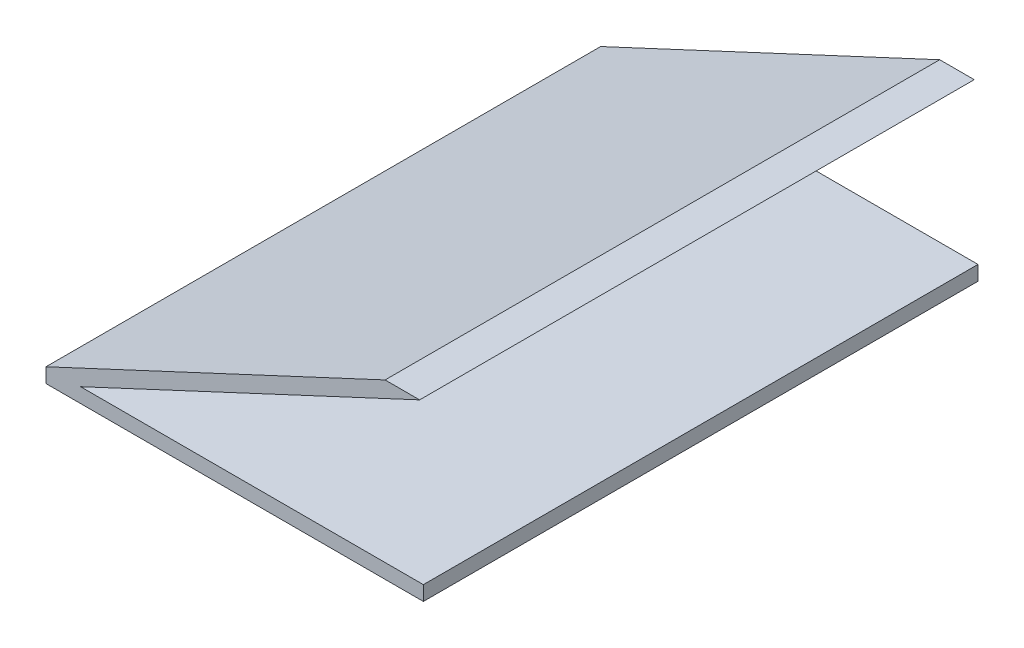
ISO-10303-21;
HEADER;
FILE_DESCRIPTION(('STEP AP214'),'2;1');
FILE_NAME('part.step','',(''),(''),'','','');
FILE_SCHEMA(('AUTOMOTIVE_DESIGN { 1 0 10303 214 1 1 1 1 }'));
ENDSEC;
DATA;
#1=APPLICATION_CONTEXT('core data for automotive mechanical design processes');
#2=APPLICATION_PROTOCOL_DEFINITION('international standard','automotive_design',2000,#1);
#3=PRODUCT_CONTEXT('',#1,'mechanical');
#4=PRODUCT('Part','Part','',(#3));
#5=PRODUCT_RELATED_PRODUCT_CATEGORY('part','',(#4));
#6=PRODUCT_DEFINITION_FORMATION('','',#4);
#7=PRODUCT_DEFINITION_CONTEXT('part definition',#1,'design');
#8=PRODUCT_DEFINITION('design','',#6,#7);
#9=PRODUCT_DEFINITION_SHAPE('','',#8);
#10=(LENGTH_UNIT() NAMED_UNIT(*) SI_UNIT(.MILLI.,.METRE.));
#11=(NAMED_UNIT(*) PLANE_ANGLE_UNIT() SI_UNIT($,.RADIAN.));
#12=(NAMED_UNIT(*) SI_UNIT($,.STERADIAN.) SOLID_ANGLE_UNIT());
#13=UNCERTAINTY_MEASURE_WITH_UNIT(LENGTH_MEASURE(1.E-05),#10,'distance_accuracy_value','');
#14=(GEOMETRIC_REPRESENTATION_CONTEXT(3) GLOBAL_UNCERTAINTY_ASSIGNED_CONTEXT((#13)) GLOBAL_UNIT_ASSIGNED_CONTEXT((#10,
#11,#12)) REPRESENTATION_CONTEXT('',''));
#15=CARTESIAN_POINT('',(0.,0.,0.));
#16=DIRECTION('',(0.,0.,1.));
#17=DIRECTION('',(1.,0.,0.));
#18=AXIS2_PLACEMENT_3D('',#15,#16,#17);
#19=CARTESIAN_POINT('',(0.,0.,380.));
#20=DIRECTION('',(0.,-1.,0.));
#21=DIRECTION('',(0.,0.,-1.));
#22=AXIS2_PLACEMENT_3D('',#19,#20,#21);
#23=PLANE('',#22);
#24=DIRECTION('',(-1.,0.,0.));
#25=VECTOR('',#24,1.);
#26=CARTESIAN_POINT('',(0.,0.,0.));
#27=LINE('',#26,#25);
#28=CARTESIAN_POINT('',(23.6620158315253,0.,0.));
#29=VERTEX_POINT('',#28);
#30=CARTESIAN_POINT('',(0.,0.,0.));
#31=VERTEX_POINT('',#30);
#32=EDGE_CURVE('E138',#29,#31,#27,.T.);
#33=ORIENTED_EDGE('',*,*,#32,.T.);
#34=DIRECTION('',(0.,0.,-1.));
#35=VECTOR('',#34,1.);
#36=CARTESIAN_POINT('',(0.,0.,380.));
#37=LINE('',#36,#35);
#38=CARTESIAN_POINT('',(0.,0.,380.));
#39=VERTEX_POINT('',#38);
#40=EDGE_CURVE('E11',#39,#31,#37,.T.);
#41=ORIENTED_EDGE('',*,*,#40,.F.);
#42=DIRECTION('',(-1.,0.,0.));
#43=VECTOR('',#42,1.);
#44=CARTESIAN_POINT('',(0.,0.,380.));
#45=LINE('',#44,#43);
#46=CARTESIAN_POINT('',(23.6620158315253,0.,380.));
#47=VERTEX_POINT('',#46);
#48=EDGE_CURVE('E157',#47,#39,#45,.T.);
#49=ORIENTED_EDGE('',*,*,#48,.F.);
#50=DIRECTION('',(0.,0.,-1.));
#51=VECTOR('',#50,1.);
#52=CARTESIAN_POINT('',(23.6620158315253,0.,380.));
#53=LINE('',#52,#51);
#54=EDGE_CURVE('E134',#47,#29,#53,.T.);
#55=ORIENTED_EDGE('',*,*,#54,.T.);
#56=EDGE_LOOP('',(#33,#41,#49,#55));
#57=FACE_BOUND('',#56,.T.);
#58=ADVANCED_FACE('F43',(#57),#23,.F.);
#59=CARTESIAN_POINT('',(0.,0.,380.));
#60=DIRECTION('',(0.422618261740694,-0.906307787036653,0.));
#61=DIRECTION('',(0.906307787036653,0.422618261740694,0.));
#62=AXIS2_PLACEMENT_3D('',#59,#60,#61);
#63=PLANE('',#62);
#64=DIRECTION('',(-0.906307787036652,-0.422618261740694,0.));
#65=VECTOR('',#64,1.);
#66=CARTESIAN_POINT('',(0.,0.,0.));
#67=LINE('',#66,#65);
#68=CARTESIAN_POINT('',(-232.321111165167,-108.333113287394,0.));
#69=VERTEX_POINT('',#68);
#70=EDGE_CURVE('E142',#31,#69,#67,.T.);
#71=ORIENTED_EDGE('',*,*,#70,.T.);
#72=DIRECTION('',(0.,0.,1.));
#73=VECTOR('',#72,1.);
#74=CARTESIAN_POINT('',(-232.321111165167,-108.333113287394,0.));
#75=LINE('',#74,#73);
#76=CARTESIAN_POINT('',(-232.321111165167,-108.333113287394,380.));
#77=VERTEX_POINT('',#76);
#78=EDGE_CURVE('E58',#69,#77,#75,.T.);
#79=ORIENTED_EDGE('',*,*,#78,.T.);
#80=DIRECTION('',(-0.906307787036652,-0.422618261740694,0.));
#81=VECTOR('',#80,1.);
#82=CARTESIAN_POINT('',(0.,0.,380.));
#83=LINE('',#82,#81);
#84=EDGE_CURVE('E98',#39,#77,#83,.T.);
#85=ORIENTED_EDGE('',*,*,#84,.F.);
#86=ORIENTED_EDGE('',*,*,#40,.T.);
#87=EDGE_LOOP('',(#71,#79,#85,#86));
#88=FACE_BOUND('',#87,.T.);
#89=ADVANCED_FACE('F188',(#88),#63,.F.);
#90=CARTESIAN_POINT('',(26.2338196297373,-118.333113287394,380.));
#91=DIRECTION('',(0.,1.,0.));
#92=DIRECTION('',(0.,0.,1.));
#93=AXIS2_PLACEMENT_3D('',#90,#91,#92);
#94=PLANE('',#93);
#95=DIRECTION('',(1.,0.,0.));
#96=VECTOR('',#95,1.);
#97=CARTESIAN_POINT('',(26.2338196297373,-118.333113287394,380.));
#98=LINE('',#97,#96);
#99=CARTESIAN_POINT('',(-232.321111165167,-118.333113287394,380.));
#100=VERTEX_POINT('',#99);
#101=CARTESIAN_POINT('',(26.2338196297373,-118.333113287394,380.));
#102=VERTEX_POINT('',#101);
#103=EDGE_CURVE('E114',#100,#102,#98,.T.);
#104=ORIENTED_EDGE('',*,*,#103,.F.);
#105=DIRECTION('',(0.,0.,1.));
#106=VECTOR('',#105,1.);
#107=CARTESIAN_POINT('',(-232.321111165167,-118.333113287394,0.));
#108=LINE('',#107,#106);
#109=CARTESIAN_POINT('',(-232.321111165167,-118.333113287394,0.));
#110=VERTEX_POINT('',#109);
#111=EDGE_CURVE('E143',#110,#100,#108,.T.);
#112=ORIENTED_EDGE('',*,*,#111,.F.);
#113=DIRECTION('',(1.,0.,0.));
#114=VECTOR('',#113,1.);
#115=CARTESIAN_POINT('',(26.2338196297373,-118.333113287394,0.));
#116=LINE('',#115,#114);
#117=CARTESIAN_POINT('',(26.2338196297373,-118.333113287394,0.));
#118=VERTEX_POINT('',#117);
#119=EDGE_CURVE('E147',#110,#118,#116,.T.);
#120=ORIENTED_EDGE('',*,*,#119,.T.);
#121=DIRECTION('',(0.,0.,-1.));
#122=VECTOR('',#121,1.);
#123=CARTESIAN_POINT('',(26.2338196297373,-118.333113287394,380.));
#124=LINE('',#123,#122);
#125=EDGE_CURVE('E51',#102,#118,#124,.T.);
#126=ORIENTED_EDGE('',*,*,#125,.F.);
#127=EDGE_LOOP('',(#104,#112,#120,#126));
#128=FACE_BOUND('',#127,.T.);
#129=ADVANCED_FACE('F190',(#128),#94,.F.);
#130=CARTESIAN_POINT('',(26.2338196297373,-108.333113287394,380.));
#131=DIRECTION('',(-1.,0.,0.));
#132=DIRECTION('',(0.,-1.,0.));
#133=AXIS2_PLACEMENT_3D('',#130,#131,#132);
#134=PLANE('',#133);
#135=DIRECTION('',(0.,1.,0.));
#136=VECTOR('',#135,1.);
#137=CARTESIAN_POINT('',(26.2338196297373,-108.333113287394,0.));
#138=LINE('',#137,#136);
#139=CARTESIAN_POINT('',(26.2338196297373,-108.333113287394,0.));
#140=VERTEX_POINT('',#139);
#141=EDGE_CURVE('E124',#118,#140,#138,.T.);
#142=ORIENTED_EDGE('',*,*,#141,.T.);
#143=DIRECTION('',(0.,0.,-1.));
#144=VECTOR('',#143,1.);
#145=CARTESIAN_POINT('',(26.2338196297373,-108.333113287394,380.));
#146=LINE('',#145,#144);
#147=CARTESIAN_POINT('',(26.2338196297373,-108.333113287394,380.));
#148=VERTEX_POINT('',#147);
#149=EDGE_CURVE('E121',#148,#140,#146,.T.);
#150=ORIENTED_EDGE('',*,*,#149,.F.);
#151=DIRECTION('',(0.,1.,0.));
#152=VECTOR('',#151,1.);
#153=CARTESIAN_POINT('',(26.2338196297373,-108.333113287394,380.));
#154=LINE('',#153,#152);
#155=EDGE_CURVE('E106',#102,#148,#154,.T.);
#156=ORIENTED_EDGE('',*,*,#155,.F.);
#157=ORIENTED_EDGE('',*,*,#125,.T.);
#158=EDGE_LOOP('',(#142,#150,#156,#157));
#159=FACE_BOUND('',#158,.T.);
#160=ADVANCED_FACE('F122',(#159),#134,.F.);
#161=CARTESIAN_POINT('',(-208.659095333642,-108.333113287394,380.));
#162=DIRECTION('',(0.,-1.,0.));
#163=DIRECTION('',(0.,0.,-1.));
#164=AXIS2_PLACEMENT_3D('',#161,#162,#163);
#165=PLANE('',#164);
#166=DIRECTION('',(-1.,0.,0.));
#167=VECTOR('',#166,1.);
#168=CARTESIAN_POINT('',(-208.659095333642,-108.333113287394,0.));
#169=LINE('',#168,#167);
#170=CARTESIAN_POINT('',(-208.659095333642,-108.333113287394,0.));
#171=VERTEX_POINT('',#170);
#172=EDGE_CURVE('E152',#140,#171,#169,.T.);
#173=ORIENTED_EDGE('',*,*,#172,.T.);
#174=DIRECTION('',(0.,0.,-1.));
#175=VECTOR('',#174,1.);
#176=CARTESIAN_POINT('',(-208.659095333642,-108.333113287394,380.));
#177=LINE('',#176,#175);
#178=CARTESIAN_POINT('',(-208.659095333642,-108.333113287394,380.));
#179=VERTEX_POINT('',#178);
#180=EDGE_CURVE('E128',#179,#171,#177,.T.);
#181=ORIENTED_EDGE('',*,*,#180,.F.);
#182=DIRECTION('',(-1.,0.,0.));
#183=VECTOR('',#182,1.);
#184=CARTESIAN_POINT('',(-208.659095333642,-108.333113287394,380.));
#185=LINE('',#184,#183);
#186=EDGE_CURVE('E110',#148,#179,#185,.T.);
#187=ORIENTED_EDGE('',*,*,#186,.F.);
#188=ORIENTED_EDGE('',*,*,#149,.T.);
#189=EDGE_LOOP('',(#173,#181,#187,#188));
#190=FACE_BOUND('',#189,.T.);
#191=ADVANCED_FACE('F130',(#190),#165,.F.);
#192=CARTESIAN_POINT('',(23.6620158315253,0.,380.));
#193=DIRECTION('',(-0.422618261740694,0.906307787036653,0.));
#194=DIRECTION('',(-0.906307787036653,-0.422618261740694,0.));
#195=AXIS2_PLACEMENT_3D('',#192,#193,#194);
#196=PLANE('',#195);
#197=DIRECTION('',(0.906307787036652,0.422618261740694,0.));
#198=VECTOR('',#197,1.);
#199=CARTESIAN_POINT('',(23.6620158315253,0.,0.));
#200=LINE('',#199,#198);
#201=EDGE_CURVE('E91',#171,#29,#200,.T.);
#202=ORIENTED_EDGE('',*,*,#201,.T.);
#203=ORIENTED_EDGE('',*,*,#54,.F.);
#204=DIRECTION('',(0.906307787036652,0.422618261740694,0.));
#205=VECTOR('',#204,1.);
#206=CARTESIAN_POINT('',(23.6620158315253,0.,380.));
#207=LINE('',#206,#205);
#208=EDGE_CURVE('E67',#179,#47,#207,.T.);
#209=ORIENTED_EDGE('',*,*,#208,.F.);
#210=ORIENTED_EDGE('',*,*,#180,.T.);
#211=EDGE_LOOP('',(#202,#203,#209,#210));
#212=FACE_BOUND('',#211,.T.);
#213=ADVANCED_FACE('F167',(#212),#196,.F.);
#214=CARTESIAN_POINT('',(0.,0.,380.));
#215=DIRECTION('',(0.,0.,-1.));
#216=DIRECTION('',(-1.,0.,0.));
#217=AXIS2_PLACEMENT_3D('',#214,#215,#216);
#218=PLANE('',#217);
#219=ORIENTED_EDGE('',*,*,#84,.T.);
#220=DIRECTION('',(0.,1.,0.));
#221=VECTOR('',#220,1.);
#222=CARTESIAN_POINT('',(-232.321111165167,-118.333113287394,380.));
#223=LINE('',#222,#221);
#224=EDGE_CURVE('E183',#100,#77,#223,.T.);
#225=ORIENTED_EDGE('',*,*,#224,.F.);
#226=ORIENTED_EDGE('',*,*,#103,.T.);
#227=ORIENTED_EDGE('',*,*,#155,.T.);
#228=ORIENTED_EDGE('',*,*,#186,.T.);
#229=ORIENTED_EDGE('',*,*,#208,.T.);
#230=ORIENTED_EDGE('',*,*,#48,.T.);
#231=EDGE_LOOP('',(#219,#225,#226,#227,#228,#229,#230));
#232=FACE_BOUND('',#231,.T.);
#233=ADVANCED_FACE('F108',(#232),#218,.F.);
#234=CARTESIAN_POINT('',(0.,0.,0.));
#235=DIRECTION('',(0.,0.,-1.));
#236=DIRECTION('',(-1.,0.,0.));
#237=AXIS2_PLACEMENT_3D('',#234,#235,#236);
#238=PLANE('',#237);
#239=DIRECTION('',(0.,1.,0.));
#240=VECTOR('',#239,1.);
#241=CARTESIAN_POINT('',(-232.321111165167,-118.333113287394,0.));
#242=LINE('',#241,#240);
#243=EDGE_CURVE('E179',#110,#69,#242,.T.);
#244=ORIENTED_EDGE('',*,*,#243,.T.);
#245=ORIENTED_EDGE('',*,*,#70,.F.);
#246=ORIENTED_EDGE('',*,*,#32,.F.);
#247=ORIENTED_EDGE('',*,*,#201,.F.);
#248=ORIENTED_EDGE('',*,*,#172,.F.);
#249=ORIENTED_EDGE('',*,*,#141,.F.);
#250=ORIENTED_EDGE('',*,*,#119,.F.);
#251=EDGE_LOOP('',(#244,#245,#246,#247,#248,#249,#250));
#252=FACE_BOUND('',#251,.T.);
#253=ADVANCED_FACE('F165',(#252),#238,.T.);
#254=CARTESIAN_POINT('',(-232.321111165167,-118.333113287394,0.));
#255=DIRECTION('',(1.,0.,0.));
#256=DIRECTION('',(0.,0.,-1.));
#257=AXIS2_PLACEMENT_3D('',#254,#255,#256);
#258=PLANE('',#257);
#259=ORIENTED_EDGE('',*,*,#224,.T.);
#260=ORIENTED_EDGE('',*,*,#78,.F.);
#261=ORIENTED_EDGE('',*,*,#243,.F.);
#262=ORIENTED_EDGE('',*,*,#111,.T.);
#263=EDGE_LOOP('',(#259,#260,#261,#262));
#264=FACE_BOUND('',#263,.T.);
#265=ADVANCED_FACE('F192',(#264),#258,.F.);
#266=CLOSED_SHELL('',(#58,#89,#129,#160,#191,#213,#233,#253,#265));
#267=MANIFOLD_SOLID_BREP('B2',#266);
#268=ADVANCED_BREP_SHAPE_REPRESENTATION('',(#18,#267),#14);
#269=SHAPE_DEFINITION_REPRESENTATION(#9,#268);
ENDSEC;
END-ISO-10303-21;
